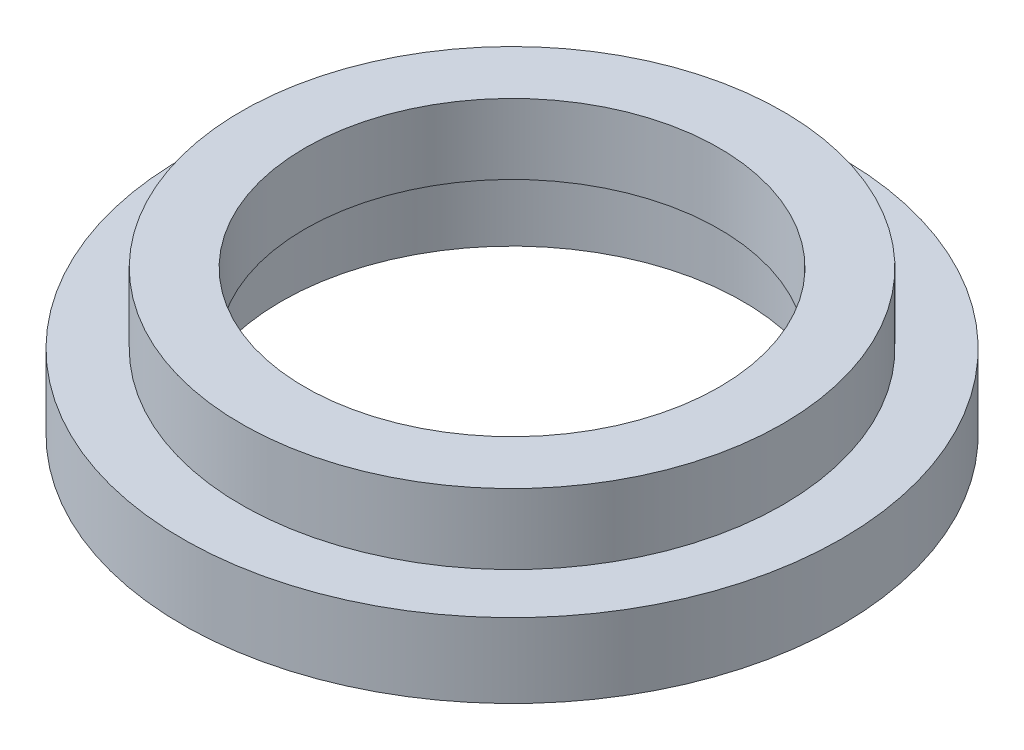
ISO-10303-21;
HEADER;
FILE_DESCRIPTION(('STEP AP214'),'2;1');
FILE_NAME('part.step','',(''),(''),'','','');
FILE_SCHEMA(('AUTOMOTIVE_DESIGN { 1 0 10303 214 1 1 1 1 }'));
ENDSEC;
DATA;
#1=APPLICATION_CONTEXT('core data for automotive mechanical design processes');
#2=APPLICATION_PROTOCOL_DEFINITION('international standard','automotive_design',2000,#1);
#3=PRODUCT_CONTEXT('',#1,'mechanical');
#4=PRODUCT('Part','Part','',(#3));
#5=PRODUCT_RELATED_PRODUCT_CATEGORY('part','',(#4));
#6=PRODUCT_DEFINITION_FORMATION('','',#4);
#7=PRODUCT_DEFINITION_CONTEXT('part definition',#1,'design');
#8=PRODUCT_DEFINITION('design','',#6,#7);
#9=PRODUCT_DEFINITION_SHAPE('','',#8);
#10=(LENGTH_UNIT() NAMED_UNIT(*) SI_UNIT(.MILLI.,.METRE.));
#11=(NAMED_UNIT(*) PLANE_ANGLE_UNIT() SI_UNIT($,.RADIAN.));
#12=(NAMED_UNIT(*) SI_UNIT($,.STERADIAN.) SOLID_ANGLE_UNIT());
#13=UNCERTAINTY_MEASURE_WITH_UNIT(LENGTH_MEASURE(1.E-05),#10,'distance_accuracy_value','');
#14=(GEOMETRIC_REPRESENTATION_CONTEXT(3) GLOBAL_UNCERTAINTY_ASSIGNED_CONTEXT((#13)) GLOBAL_UNIT_ASSIGNED_CONTEXT((#10,
#11,#12)) REPRESENTATION_CONTEXT('',''));
#15=CARTESIAN_POINT('',(0.,0.,0.));
#16=DIRECTION('',(0.,0.,1.));
#17=DIRECTION('',(1.,0.,0.));
#18=AXIS2_PLACEMENT_3D('',#15,#16,#17);
#19=CARTESIAN_POINT('',(37.26,513.2,512.72));
#20=DIRECTION('',(0.,-1.,0.));
#21=DIRECTION('',(1.,0.,0.));
#22=AXIS2_PLACEMENT_3D('',#19,#20,#21);
#23=CYLINDRICAL_SURFACE('',#22,4.4);
#24=CARTESIAN_POINT('',(37.26,513.2,512.72));
#25=DIRECTION('',(0.,-1.,0.));
#26=DIRECTION('',(1.,0.,0.));
#27=AXIS2_PLACEMENT_3D('',#24,#25,#26);
#28=CIRCLE('',#27,4.4);
#29=CARTESIAN_POINT('',(41.66,513.2,512.72));
#30=VERTEX_POINT('',#29);
#31=EDGE_CURVE('E81',#30,#30,#28,.T.);
#32=ORIENTED_EDGE('',*,*,#31,.T.);
#33=DIRECTION('',(0.,1.,0.));
#34=VECTOR('',#33,1.);
#35=CARTESIAN_POINT('',(41.66,513.2,512.72));
#36=LINE('',#35,#34);
#37=CARTESIAN_POINT('',(41.66,514.69,512.72));
#38=VERTEX_POINT('',#37);
#39=EDGE_CURVE('E9',#30,#38,#36,.T.);
#40=ORIENTED_EDGE('',*,*,#39,.T.);
#41=CARTESIAN_POINT('',(37.26,514.69,512.72));
#42=DIRECTION('',(0.,-1.,0.));
#43=DIRECTION('',(1.,0.,0.));
#44=AXIS2_PLACEMENT_3D('',#41,#42,#43);
#45=CIRCLE('',#44,4.4);
#46=EDGE_CURVE('E24',#38,#38,#45,.T.);
#47=ORIENTED_EDGE('',*,*,#46,.F.);
#48=ORIENTED_EDGE('',*,*,#39,.F.);
#49=EDGE_LOOP('',(#32,#40,#47,#48));
#50=FACE_BOUND('',#49,.T.);
#51=ADVANCED_FACE('F15',(#50),#23,.F.);
#52=CARTESIAN_POINT('',(37.26,514.69,512.72));
#53=DIRECTION('',(0.,-1.,0.));
#54=DIRECTION('',(0.,0.,-1.));
#55=AXIS2_PLACEMENT_3D('',#52,#53,#54);
#56=PLANE('',#55);
#57=ORIENTED_EDGE('',*,*,#46,.T.);
#58=EDGE_LOOP('',(#57));
#59=FACE_BOUND('',#58,.T.);
#60=CARTESIAN_POINT('',(37.26,514.69,512.72));
#61=DIRECTION('',(0.,-1.,0.));
#62=DIRECTION('',(1.,0.,0.));
#63=AXIS2_PLACEMENT_3D('',#60,#61,#62);
#64=CIRCLE('',#63,5.75);
#65=CARTESIAN_POINT('',(43.01,514.69,512.72));
#66=VERTEX_POINT('',#65);
#67=EDGE_CURVE('E74',#66,#66,#64,.T.);
#68=ORIENTED_EDGE('',*,*,#67,.F.);
#69=EDGE_LOOP('',(#68));
#70=FACE_BOUND('',#69,.T.);
#71=ADVANCED_FACE('F86',(#59,#70),#56,.F.);
#72=CARTESIAN_POINT('',(37.26,513.2,512.72));
#73=DIRECTION('',(0.,-1.,0.));
#74=DIRECTION('',(0.,0.,-1.));
#75=AXIS2_PLACEMENT_3D('',#72,#73,#74);
#76=PLANE('',#75);
#77=ORIENTED_EDGE('',*,*,#31,.F.);
#78=EDGE_LOOP('',(#77));
#79=FACE_BOUND('',#78,.T.);
#80=CARTESIAN_POINT('',(37.26,513.2,512.72));
#81=DIRECTION('',(0.,-1.,0.));
#82=DIRECTION('',(1.,0.,0.));
#83=AXIS2_PLACEMENT_3D('',#80,#81,#82);
#84=CIRCLE('',#83,4.9);
#85=CARTESIAN_POINT('',(42.16,513.2,512.72));
#86=VERTEX_POINT('',#85);
#87=EDGE_CURVE('E62',#86,#86,#84,.T.);
#88=ORIENTED_EDGE('',*,*,#87,.T.);
#89=EDGE_LOOP('',(#88));
#90=FACE_BOUND('',#89,.T.);
#91=ADVANCED_FACE('F63',(#79,#90),#76,.T.);
#92=CARTESIAN_POINT('',(37.26,513.2,512.72));
#93=DIRECTION('',(0.,-1.,0.));
#94=DIRECTION('',(1.,0.,0.));
#95=AXIS2_PLACEMENT_3D('',#92,#93,#94);
#96=CYLINDRICAL_SURFACE('',#95,5.75);
#97=DIRECTION('',(0.,1.,0.));
#98=VECTOR('',#97,1.);
#99=CARTESIAN_POINT('',(43.01,513.2,512.72));
#100=LINE('',#99,#98);
#101=CARTESIAN_POINT('',(43.01,513.2,512.72));
#102=VERTEX_POINT('',#101);
#103=EDGE_CURVE('E67',#102,#66,#100,.T.);
#104=ORIENTED_EDGE('',*,*,#103,.T.);
#105=ORIENTED_EDGE('',*,*,#67,.T.);
#106=ORIENTED_EDGE('',*,*,#103,.F.);
#107=CARTESIAN_POINT('',(37.26,513.2,512.72));
#108=DIRECTION('',(0.,-1.,0.));
#109=DIRECTION('',(1.,0.,0.));
#110=AXIS2_PLACEMENT_3D('',#107,#108,#109);
#111=CIRCLE('',#110,5.75);
#112=EDGE_CURVE('E77',#102,#102,#111,.T.);
#113=ORIENTED_EDGE('',*,*,#112,.F.);
#114=EDGE_LOOP('',(#104,#105,#106,#113));
#115=FACE_BOUND('',#114,.T.);
#116=ADVANCED_FACE('F91',(#115),#96,.T.);
#117=CARTESIAN_POINT('',(37.26,511.62,512.72));
#118=DIRECTION('',(0.,-1.,0.));
#119=DIRECTION('',(1.,0.,0.));
#120=AXIS2_PLACEMENT_3D('',#117,#118,#119);
#121=CYLINDRICAL_SURFACE('',#120,4.9);
#122=CARTESIAN_POINT('',(37.26,511.62,512.72));
#123=DIRECTION('',(0.,-1.,0.));
#124=DIRECTION('',(1.,0.,0.));
#125=AXIS2_PLACEMENT_3D('',#122,#123,#124);
#126=CIRCLE('',#125,4.9);
#127=CARTESIAN_POINT('',(42.16,511.62,512.72));
#128=VERTEX_POINT('',#127);
#129=EDGE_CURVE('E184',#128,#128,#126,.T.);
#130=ORIENTED_EDGE('',*,*,#129,.T.);
#131=DIRECTION('',(0.,1.,0.));
#132=VECTOR('',#131,1.);
#133=CARTESIAN_POINT('',(42.16,511.62,512.72));
#134=LINE('',#133,#132);
#135=EDGE_CURVE('E68',#128,#86,#134,.T.);
#136=ORIENTED_EDGE('',*,*,#135,.T.);
#137=ORIENTED_EDGE('',*,*,#87,.F.);
#138=ORIENTED_EDGE('',*,*,#135,.F.);
#139=EDGE_LOOP('',(#130,#136,#137,#138));
#140=FACE_BOUND('',#139,.T.);
#141=ADVANCED_FACE('F98',(#140),#121,.F.);
#142=CARTESIAN_POINT('',(37.26,513.2,512.72));
#143=DIRECTION('',(0.,-1.,0.));
#144=DIRECTION('',(0.,0.,-1.));
#145=AXIS2_PLACEMENT_3D('',#142,#143,#144);
#146=PLANE('',#145);
#147=ORIENTED_EDGE('',*,*,#112,.T.);
#148=EDGE_LOOP('',(#147));
#149=FACE_BOUND('',#148,.T.);
#150=CARTESIAN_POINT('',(37.26,513.2,512.72));
#151=DIRECTION('',(0.,-1.,0.));
#152=DIRECTION('',(1.,0.,0.));
#153=AXIS2_PLACEMENT_3D('',#150,#151,#152);
#154=CIRCLE('',#153,7.);
#155=CARTESIAN_POINT('',(44.26,513.2,512.72));
#156=VERTEX_POINT('',#155);
#157=EDGE_CURVE('E172',#156,#156,#154,.T.);
#158=ORIENTED_EDGE('',*,*,#157,.F.);
#159=EDGE_LOOP('',(#158));
#160=FACE_BOUND('',#159,.T.);
#161=ADVANCED_FACE('F135',(#149,#160),#146,.F.);
#162=CARTESIAN_POINT('',(37.26,511.62,512.72));
#163=DIRECTION('',(0.,-1.,0.));
#164=DIRECTION('',(0.,0.,-1.));
#165=AXIS2_PLACEMENT_3D('',#162,#163,#164);
#166=PLANE('',#165);
#167=ORIENTED_EDGE('',*,*,#129,.F.);
#168=EDGE_LOOP('',(#167));
#169=FACE_BOUND('',#168,.T.);
#170=CARTESIAN_POINT('',(37.26,511.62,512.72));
#171=DIRECTION('',(0.,-1.,0.));
#172=DIRECTION('',(1.,0.,0.));
#173=AXIS2_PLACEMENT_3D('',#170,#171,#172);
#174=CIRCLE('',#173,7.);
#175=CARTESIAN_POINT('',(44.26,511.62,512.72));
#176=VERTEX_POINT('',#175);
#177=EDGE_CURVE('E173',#176,#176,#174,.T.);
#178=ORIENTED_EDGE('',*,*,#177,.T.);
#179=EDGE_LOOP('',(#178));
#180=FACE_BOUND('',#179,.T.);
#181=ADVANCED_FACE('F144',(#169,#180),#166,.T.);
#182=CARTESIAN_POINT('',(37.26,511.62,512.72));
#183=DIRECTION('',(0.,-1.,0.));
#184=DIRECTION('',(1.,0.,0.));
#185=AXIS2_PLACEMENT_3D('',#182,#183,#184);
#186=CYLINDRICAL_SURFACE('',#185,7.);
#187=DIRECTION('',(0.,1.,0.));
#188=VECTOR('',#187,1.);
#189=CARTESIAN_POINT('',(44.26,511.62,512.72));
#190=LINE('',#189,#188);
#191=EDGE_CURVE('E170',#176,#156,#190,.T.);
#192=ORIENTED_EDGE('',*,*,#191,.T.);
#193=ORIENTED_EDGE('',*,*,#157,.T.);
#194=ORIENTED_EDGE('',*,*,#191,.F.);
#195=ORIENTED_EDGE('',*,*,#177,.F.);
#196=EDGE_LOOP('',(#192,#193,#194,#195));
#197=FACE_BOUND('',#196,.T.);
#198=ADVANCED_FACE('F154',(#197),#186,.T.);
#199=CLOSED_SHELL('',(#51,#71,#91,#116,#141,#161,#181,#198));
#200=MANIFOLD_SOLID_BREP('B1',#199);
#201=ADVANCED_BREP_SHAPE_REPRESENTATION('',(#18,#200),#14);
#202=SHAPE_DEFINITION_REPRESENTATION(#9,#201);
ENDSEC;
END-ISO-10303-21;
